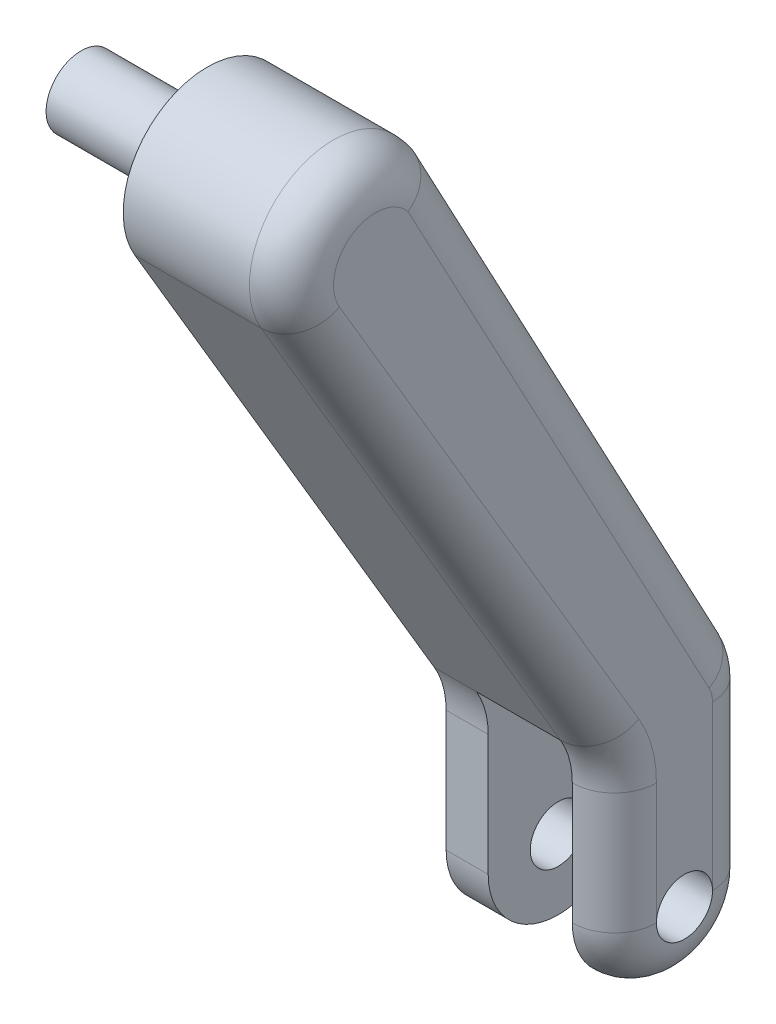
ISO-10303-21;
HEADER;
FILE_DESCRIPTION(('STEP AP214'),'2;1');
FILE_NAME('part.step','',(''),(''),'','','');
FILE_SCHEMA(('AUTOMOTIVE_DESIGN { 1 0 10303 214 1 1 1 1 }'));
ENDSEC;
DATA;
#1=APPLICATION_CONTEXT('core data for automotive mechanical design processes');
#2=APPLICATION_PROTOCOL_DEFINITION('international standard','automotive_design',2000,#1);
#3=PRODUCT_CONTEXT('',#1,'mechanical');
#4=PRODUCT('Part','Part','',(#3));
#5=PRODUCT_RELATED_PRODUCT_CATEGORY('part','',(#4));
#6=PRODUCT_DEFINITION_FORMATION('','',#4);
#7=PRODUCT_DEFINITION_CONTEXT('part definition',#1,'design');
#8=PRODUCT_DEFINITION('design','',#6,#7);
#9=PRODUCT_DEFINITION_SHAPE('','',#8);
#10=(LENGTH_UNIT() NAMED_UNIT(*) SI_UNIT(.MILLI.,.METRE.));
#11=(NAMED_UNIT(*) PLANE_ANGLE_UNIT() SI_UNIT($,.RADIAN.));
#12=(NAMED_UNIT(*) SI_UNIT($,.STERADIAN.) SOLID_ANGLE_UNIT());
#13=UNCERTAINTY_MEASURE_WITH_UNIT(LENGTH_MEASURE(1.E-05),#10,'distance_accuracy_value','');
#14=(GEOMETRIC_REPRESENTATION_CONTEXT(3) GLOBAL_UNCERTAINTY_ASSIGNED_CONTEXT((#13)) GLOBAL_UNIT_ASSIGNED_CONTEXT((#10,
#11,#12)) REPRESENTATION_CONTEXT('',''));
#15=CARTESIAN_POINT('',(0.,0.,0.));
#16=DIRECTION('',(0.,0.,1.));
#17=DIRECTION('',(1.,0.,0.));
#18=AXIS2_PLACEMENT_3D('',#15,#16,#17);
#19=CARTESIAN_POINT('',(0.,13.9972027354736,-26.1932888329424));
#20=DIRECTION('',(0.,-0.471307643009905,0.88196888019955));
#21=DIRECTION('',(0.,-0.88196888019955,-0.471307643009905));
#22=AXIS2_PLACEMENT_3D('',#19,#20,#21);
#23=PLANE('',#22);
#24=DIRECTION('',(1.,0.,0.));
#25=VECTOR('',#24,1.);
#26=CARTESIAN_POINT('',(0.,17.7380335510086,-24.1942589418087));
#27=LINE('',#26,#25);
#28=CARTESIAN_POINT('',(20.,17.7380335510086,-24.1942589418087));
#29=VERTEX_POINT('',#28);
#30=CARTESIAN_POINT('',(45.,17.7380335510086,-24.1942589418087));
#31=VERTEX_POINT('',#30);
#32=EDGE_CURVE('E203',#29,#31,#27,.T.);
#33=ORIENTED_EDGE('',*,*,#32,.T.);
#34=DIRECTION('',(0.,-0.88196888019955,-0.471307643009905));
#35=VECTOR('',#34,1.);
#36=CARTESIAN_POINT('',(45.,-184.18688446411,-132.099151405975));
#37=LINE('',#36,#35);
#38=CARTESIAN_POINT('',(45.,-174.695150912895,-127.026946854847));
#39=VERTEX_POINT('',#38);
#40=EDGE_CURVE('E212',#31,#39,#37,.T.);
#41=ORIENTED_EDGE('',*,*,#40,.T.);
#42=DIRECTION('',(1.,0.,0.));
#43=VECTOR('',#42,1.);
#44=CARTESIAN_POINT('',(15.,-174.695150912895,-127.026946854847));
#45=LINE('',#44,#43);
#46=CARTESIAN_POINT('',(15.,-174.695150912895,-127.026946854847));
#47=VERTEX_POINT('',#46);
#48=EDGE_CURVE('E365',#47,#39,#45,.T.);
#49=ORIENTED_EDGE('',*,*,#48,.F.);
#50=DIRECTION('',(0.,0.881968880199549,0.471307643009906));
#51=VECTOR('',#50,1.);
#52=CARTESIAN_POINT('',(15.,-184.18688446411,-132.099151405975));
#53=LINE('',#52,#51);
#54=CARTESIAN_POINT('',(15.,-184.18688446411,-132.099151405975));
#55=VERTEX_POINT('',#54);
#56=EDGE_CURVE('E420',#55,#47,#53,.T.);
#57=ORIENTED_EDGE('',*,*,#56,.F.);
#58=DIRECTION('',(1.,0.,0.));
#59=VECTOR('',#58,1.);
#60=CARTESIAN_POINT('',(0.,-184.18688446411,-132.099151405975));
#61=LINE('',#60,#59);
#62=CARTESIAN_POINT('',(0.,-184.18688446411,-132.099151405975));
#63=VERTEX_POINT('',#62);
#64=EDGE_CURVE('E404',#63,#55,#61,.T.);
#65=ORIENTED_EDGE('',*,*,#64,.F.);
#66=DIRECTION('',(0.,-0.88196888019955,-0.471307643009905));
#67=VECTOR('',#66,1.);
#68=CARTESIAN_POINT('',(0.,13.9972027354736,-26.1932888329424));
#69=LINE('',#68,#67);
#70=CARTESIAN_POINT('',(0.,10.2563719199386,-28.1923187240761));
#71=VERTEX_POINT('',#70);
#72=EDGE_CURVE('E399',#71,#63,#69,.T.);
#73=ORIENTED_EDGE('',*,*,#72,.F.);
#74=DIRECTION('',(-1.,0.,0.));
#75=VECTOR('',#74,1.);
#76=CARTESIAN_POINT('',(20.,10.2563719199386,-28.1923187240761));
#77=LINE('',#76,#75);
#78=CARTESIAN_POINT('',(20.,10.2563719199386,-28.1923187240761));
#79=VERTEX_POINT('',#78);
#80=EDGE_CURVE('E202',#71,#79,#77,.F.);
#81=ORIENTED_EDGE('',*,*,#80,.T.);
#82=DIRECTION('',(0.,-0.88196888019955,-0.471307643009905));
#83=VECTOR('',#82,1.);
#84=CARTESIAN_POINT('',(20.,13.9972027354736,-26.1932888329424));
#85=LINE('',#84,#83);
#86=EDGE_CURVE('E199',#29,#79,#85,.T.);
#87=ORIENTED_EDGE('',*,*,#86,.F.);
#88=EDGE_LOOP('',(#33,#41,#49,#57,#65,#73,#81,#87));
#89=FACE_BOUND('',#88,.T.);
#90=ADVANCED_FACE('F41',(#89),#23,.F.);
#91=CARTESIAN_POINT('',(0.,-196.184626191974,-110.166203737423));
#92=DIRECTION('',(1.,0.,0.));
#93=DIRECTION('',(0.,0.,-1.));
#94=AXIS2_PLACEMENT_3D('',#91,#92,#93);
#95=CYLINDRICAL_SURFACE('',#94,25.);
#96=ORIENTED_EDGE('',*,*,#64,.T.);
#97=CARTESIAN_POINT('',(15.,-196.184626191974,-110.166203737423));
#98=DIRECTION('',(1.,0.,0.));
#99=DIRECTION('',(0.,0.,-1.));
#100=AXIS2_PLACEMENT_3D('',#97,#98,#99);
#101=CIRCLE('',#100,25.);
#102=CARTESIAN_POINT('',(15.,-196.184626191974,-135.166203737423));
#103=VERTEX_POINT('',#102);
#104=EDGE_CURVE('E419',#103,#55,#101,.T.);
#105=ORIENTED_EDGE('',*,*,#104,.F.);
#106=DIRECTION('',(1.,0.,0.));
#107=VECTOR('',#106,1.);
#108=CARTESIAN_POINT('',(0.,-196.184626191974,-135.166203737423));
#109=LINE('',#108,#107);
#110=CARTESIAN_POINT('',(0.,-196.184626191974,-135.166203737423));
#111=VERTEX_POINT('',#110);
#112=EDGE_CURVE('E407',#111,#103,#109,.T.);
#113=ORIENTED_EDGE('',*,*,#112,.F.);
#114=CARTESIAN_POINT('',(0.,-196.184626191974,-110.166203737423));
#115=DIRECTION('',(1.,0.,0.));
#116=DIRECTION('',(0.,0.,-1.));
#117=AXIS2_PLACEMENT_3D('',#114,#115,#116);
#118=CIRCLE('',#117,25.);
#119=EDGE_CURVE('E396',#111,#63,#118,.T.);
#120=ORIENTED_EDGE('',*,*,#119,.T.);
#121=EDGE_LOOP('',(#96,#105,#113,#120));
#122=FACE_BOUND('',#121,.T.);
#123=ADVANCED_FACE('F291',(#122),#95,.T.);
#124=CARTESIAN_POINT('',(0.,0.,-135.166203737423));
#125=DIRECTION('',(0.,0.,-1.));
#126=DIRECTION('',(0.,1.,0.));
#127=AXIS2_PLACEMENT_3D('',#124,#125,#126);
#128=PLANE('',#127);
#129=ORIENTED_EDGE('',*,*,#112,.T.);
#130=DIRECTION('',(0.,1.,0.));
#131=VECTOR('',#130,1.);
#132=CARTESIAN_POINT('',(15.,-254.457280983061,-135.166203737423));
#133=LINE('',#132,#131);
#134=CARTESIAN_POINT('',(15.,-254.457280983061,-135.166203737423));
#135=VERTEX_POINT('',#134);
#136=EDGE_CURVE('E413',#135,#103,#133,.T.);
#137=ORIENTED_EDGE('',*,*,#136,.F.);
#138=DIRECTION('',(1.,0.,0.));
#139=VECTOR('',#138,1.);
#140=CARTESIAN_POINT('',(0.,-254.457280983061,-135.166203737423));
#141=LINE('',#140,#139);
#142=CARTESIAN_POINT('',(0.,-254.457280983061,-135.166203737423));
#143=VERTEX_POINT('',#142);
#144=EDGE_CURVE('E191',#143,#135,#141,.T.);
#145=ORIENTED_EDGE('',*,*,#144,.F.);
#146=DIRECTION('',(0.,1.,0.));
#147=VECTOR('',#146,1.);
#148=CARTESIAN_POINT('',(0.,0.,-135.166203737423));
#149=LINE('',#148,#147);
#150=EDGE_CURVE('E393',#143,#111,#149,.T.);
#151=ORIENTED_EDGE('',*,*,#150,.T.);
#152=EDGE_LOOP('',(#129,#137,#145,#151));
#153=FACE_BOUND('',#152,.T.);
#154=ADVANCED_FACE('F297',(#153),#128,.T.);
#155=CARTESIAN_POINT('',(0.,-254.457280983061,-110.166203737423));
#156=DIRECTION('',(1.,0.,0.));
#157=DIRECTION('',(0.,0.,-1.));
#158=AXIS2_PLACEMENT_3D('',#155,#156,#157);
#159=CYLINDRICAL_SURFACE('',#158,25.);
#160=ORIENTED_EDGE('',*,*,#144,.T.);
#161=CARTESIAN_POINT('',(15.,-254.457280983061,-110.166203737423));
#162=DIRECTION('',(1.,0.,0.));
#163=DIRECTION('',(0.,0.,-1.));
#164=AXIS2_PLACEMENT_3D('',#161,#162,#163);
#165=CIRCLE('',#164,25.);
#166=CARTESIAN_POINT('',(15.,-254.457280983061,-85.1662037374227));
#167=VERTEX_POINT('',#166);
#168=EDGE_CURVE('E184',#167,#135,#165,.T.);
#169=ORIENTED_EDGE('',*,*,#168,.F.);
#170=DIRECTION('',(1.,0.,0.));
#171=VECTOR('',#170,1.);
#172=CARTESIAN_POINT('',(0.,-254.457280983061,-85.1662037374227));
#173=LINE('',#172,#171);
#174=CARTESIAN_POINT('',(0.,-254.457280983061,-85.1662037374227));
#175=VERTEX_POINT('',#174);
#176=EDGE_CURVE('E183',#175,#167,#173,.T.);
#177=ORIENTED_EDGE('',*,*,#176,.F.);
#178=CARTESIAN_POINT('',(0.,-254.457280983061,-110.166203737423));
#179=DIRECTION('',(1.,0.,0.));
#180=DIRECTION('',(0.,0.,-1.));
#181=AXIS2_PLACEMENT_3D('',#178,#179,#180);
#182=CIRCLE('',#181,25.);
#183=EDGE_CURVE('E390',#175,#143,#182,.T.);
#184=ORIENTED_EDGE('',*,*,#183,.T.);
#185=EDGE_LOOP('',(#160,#169,#177,#184));
#186=FACE_BOUND('',#185,.T.);
#187=ADVANCED_FACE('F307',(#186),#159,.T.);
#188=CARTESIAN_POINT('',(0.,0.,-85.1662037374227));
#189=DIRECTION('',(0.,0.,1.));
#190=DIRECTION('',(1.,0.,0.));
#191=AXIS2_PLACEMENT_3D('',#188,#189,#190);
#192=PLANE('',#191);
#193=ORIENTED_EDGE('',*,*,#176,.T.);
#194=DIRECTION('',(0.,-1.,0.));
#195=VECTOR('',#194,1.);
#196=CARTESIAN_POINT('',(15.,-254.457280983061,-85.1662037374227));
#197=LINE('',#196,#195);
#198=CARTESIAN_POINT('',(15.,-211.225481241882,-85.1662037374227));
#199=VERTEX_POINT('',#198);
#200=EDGE_CURVE('E167',#199,#167,#197,.T.);
#201=ORIENTED_EDGE('',*,*,#200,.F.);
#202=DIRECTION('',(1.,0.,0.));
#203=VECTOR('',#202,1.);
#204=CARTESIAN_POINT('',(0.,-211.225481241882,-85.1662037374227));
#205=LINE('',#204,#203);
#206=CARTESIAN_POINT('',(0.,-211.225481241882,-85.1662037374227));
#207=VERTEX_POINT('',#206);
#208=EDGE_CURVE('E181',#207,#199,#205,.T.);
#209=ORIENTED_EDGE('',*,*,#208,.F.);
#210=DIRECTION('',(0.,-1.,0.));
#211=VECTOR('',#210,1.);
#212=CARTESIAN_POINT('',(0.,0.,-85.1662037374227));
#213=LINE('',#212,#211);
#214=EDGE_CURVE('E388',#207,#175,#213,.T.);
#215=ORIENTED_EDGE('',*,*,#214,.T.);
#216=EDGE_LOOP('',(#193,#201,#209,#215));
#217=FACE_BOUND('',#216,.T.);
#218=ADVANCED_FACE('F179',(#217),#192,.T.);
#219=CARTESIAN_POINT('',(0.,-211.225481241882,-55.1662037374227));
#220=DIRECTION('',(1.,0.,0.));
#221=DIRECTION('',(0.,0.,-1.));
#222=AXIS2_PLACEMENT_3D('',#219,#220,#221);
#223=CYLINDRICAL_SURFACE('',#222,30.);
#224=CARTESIAN_POINT('',(15.,-211.225481241882,-55.1662037374227));
#225=DIRECTION('',(-1.,0.,0.));
#226=DIRECTION('',(0.,0.,-1.));
#227=AXIS2_PLACEMENT_3D('',#224,#225,#226);
#228=CIRCLE('',#227,30.);
#229=CARTESIAN_POINT('',(15.,-195.95899361436,-80.9912759642089));
#230=VERTEX_POINT('',#229);
#231=EDGE_CURVE('E163',#230,#199,#228,.T.);
#232=ORIENTED_EDGE('',*,*,#231,.F.);
#233=DIRECTION('',(1.,0.,0.));
#234=VECTOR('',#233,1.);
#235=CARTESIAN_POINT('',(0.,-195.95899361436,-80.9912759642089));
#236=LINE('',#235,#234);
#237=CARTESIAN_POINT('',(0.,-195.95899361436,-80.9912759642089));
#238=VERTEX_POINT('',#237);
#239=EDGE_CURVE('E189',#238,#230,#236,.T.);
#240=ORIENTED_EDGE('',*,*,#239,.F.);
#241=CARTESIAN_POINT('',(0.,-211.225481241882,-55.1662037374227));
#242=DIRECTION('',(1.,0.,0.));
#243=DIRECTION('',(0.,0.,-1.));
#244=AXIS2_PLACEMENT_3D('',#241,#242,#243);
#245=CIRCLE('',#244,30.);
#246=EDGE_CURVE('E187',#207,#238,#245,.T.);
#247=ORIENTED_EDGE('',*,*,#246,.F.);
#248=ORIENTED_EDGE('',*,*,#208,.T.);
#249=EDGE_LOOP('',(#232,#240,#247,#248));
#250=FACE_BOUND('',#249,.T.);
#251=ADVANCED_FACE('F186',(#250),#223,.F.);
#252=CARTESIAN_POINT('',(0.,-254.457280983061,-110.166203737423));
#253=DIRECTION('',(1.,0.,0.));
#254=DIRECTION('',(0.,0.,-1.));
#255=AXIS2_PLACEMENT_3D('',#252,#253,#254);
#256=CYLINDRICAL_SURFACE('',#255,10.);
#257=CARTESIAN_POINT('',(0.,-254.457280983061,-110.166203737423));
#258=DIRECTION('',(1.,0.,0.));
#259=DIRECTION('',(0.,0.,-1.));
#260=AXIS2_PLACEMENT_3D('',#257,#258,#259);
#261=CIRCLE('',#260,10.);
#262=CARTESIAN_POINT('',(0.,-254.457280983061,-120.166203737423));
#263=VERTEX_POINT('',#262);
#264=EDGE_CURVE('E198',#263,#263,#261,.T.);
#265=ORIENTED_EDGE('',*,*,#264,.F.);
#266=EDGE_LOOP('',(#265));
#267=FACE_BOUND('',#266,.T.);
#268=CARTESIAN_POINT('',(15.,-254.457280983061,-110.166203737423));
#269=DIRECTION('',(1.,0.,0.));
#270=DIRECTION('',(0.,0.,-1.));
#271=AXIS2_PLACEMENT_3D('',#268,#269,#270);
#272=CIRCLE('',#271,10.);
#273=CARTESIAN_POINT('',(15.,-254.457280983061,-120.166203737423));
#274=VERTEX_POINT('',#273);
#275=EDGE_CURVE('E220',#274,#274,#272,.F.);
#276=ORIENTED_EDGE('',*,*,#275,.F.);
#277=EDGE_LOOP('',(#276));
#278=FACE_BOUND('',#277,.T.);
#279=ADVANCED_FACE('F316',(#267,#278),#256,.F.);
#280=CARTESIAN_POINT('',(20.,0.,0.));
#281=DIRECTION('',(-1.,0.,0.));
#282=DIRECTION('',(0.,0.,1.));
#283=AXIS2_PLACEMENT_3D('',#280,#281,#282);
#284=CYLINDRICAL_SURFACE('',#283,30.);
#285=DIRECTION('',(1.,0.,0.));
#286=VECTOR('',#285,1.);
#287=CARTESIAN_POINT('',(0.,-15.2664876275219,25.8250722267861));
#288=LINE('',#287,#286);
#289=CARTESIAN_POINT('',(0.,-15.2664876275219,25.8250722267861));
#290=VERTEX_POINT('',#289);
#291=CARTESIAN_POINT('',(45.,-15.2664876275219,25.8250722267861));
#292=VERTEX_POINT('',#291);
#293=EDGE_CURVE('E193',#290,#292,#288,.T.);
#294=ORIENTED_EDGE('',*,*,#293,.T.);
#295=CARTESIAN_POINT('',(45.,0.,0.));
#296=DIRECTION('',(1.,0.,0.));
#297=DIRECTION('',(0.,0.,-1.));
#298=AXIS2_PLACEMENT_3D('',#295,#296,#297);
#299=CIRCLE('',#298,30.);
#300=EDGE_CURVE('E11',#292,#31,#299,.F.);
#301=ORIENTED_EDGE('',*,*,#300,.T.);
#302=ORIENTED_EDGE('',*,*,#32,.F.);
#303=CARTESIAN_POINT('',(20.,0.,0.));
#304=DIRECTION('',(1.,0.,0.));
#305=DIRECTION('',(0.,0.,-1.));
#306=AXIS2_PLACEMENT_3D('',#303,#304,#305);
#307=CIRCLE('',#306,30.);
#308=EDGE_CURVE('E213',#79,#29,#307,.T.);
#309=ORIENTED_EDGE('',*,*,#308,.F.);
#310=ORIENTED_EDGE('',*,*,#80,.F.);
#311=CARTESIAN_POINT('',(0.,0.,0.));
#312=DIRECTION('',(1.,0.,0.));
#313=DIRECTION('',(0.,0.,-1.));
#314=AXIS2_PLACEMENT_3D('',#311,#312,#313);
#315=CIRCLE('',#314,30.);
#316=EDGE_CURVE('E208',#71,#290,#315,.T.);
#317=ORIENTED_EDGE('',*,*,#316,.T.);
#318=EDGE_LOOP('',(#294,#301,#302,#309,#310,#317));
#319=FACE_BOUND('',#318,.T.);
#320=ADVANCED_FACE('F332',(#319),#284,.T.);
#321=CARTESIAN_POINT('',(20.,0.,0.));
#322=DIRECTION('',(1.,0.,0.));
#323=DIRECTION('',(0.,0.,-1.));
#324=AXIS2_PLACEMENT_3D('',#321,#322,#323);
#325=PLANE('',#324);
#326=ORIENTED_EDGE('',*,*,#308,.T.);
#327=ORIENTED_EDGE('',*,*,#86,.T.);
#328=EDGE_LOOP('',(#326,#327));
#329=FACE_BOUND('',#328,.T.);
#330=ADVANCED_FACE('F329',(#329),#325,.T.);
#331=CARTESIAN_POINT('',(0.,0.,0.));
#332=DIRECTION('',(1.,0.,0.));
#333=DIRECTION('',(0.,0.,-1.));
#334=AXIS2_PLACEMENT_3D('',#331,#332,#333);
#335=PLANE('',#334);
#336=CARTESIAN_POINT('',(0.,0.,0.));
#337=DIRECTION('',(-1.,0.,0.));
#338=DIRECTION('',(0.,0.,1.));
#339=AXIS2_PLACEMENT_3D('',#336,#337,#338);
#340=CIRCLE('',#339,12.5);
#341=CARTESIAN_POINT('',(0.,0.,-12.5));
#342=VERTEX_POINT('',#341);
#343=EDGE_CURVE('E209',#342,#342,#340,.T.);
#344=ORIENTED_EDGE('',*,*,#343,.F.);
#345=EDGE_LOOP('',(#344));
#346=FACE_BOUND('',#345,.T.);
#347=DIRECTION('',(0.,-0.860835740892872,-0.508882920917396));
#348=VECTOR('',#347,1.);
#349=CARTESIAN_POINT('',(0.,-15.2664876275219,25.8250722267861));
#350=LINE('',#349,#348);
#351=EDGE_CURVE('E385',#290,#238,#350,.T.);
#352=ORIENTED_EDGE('',*,*,#351,.F.);
#353=ORIENTED_EDGE('',*,*,#316,.F.);
#354=ORIENTED_EDGE('',*,*,#72,.T.);
#355=ORIENTED_EDGE('',*,*,#119,.F.);
#356=ORIENTED_EDGE('',*,*,#150,.F.);
#357=ORIENTED_EDGE('',*,*,#183,.F.);
#358=ORIENTED_EDGE('',*,*,#214,.F.);
#359=ORIENTED_EDGE('',*,*,#246,.T.);
#360=EDGE_LOOP('',(#352,#353,#354,#355,#356,#357,#358,#359));
#361=FACE_BOUND('',#360,.T.);
#362=ORIENTED_EDGE('',*,*,#264,.T.);
#363=EDGE_LOOP('',(#362));
#364=FACE_BOUND('',#363,.T.);
#365=ADVANCED_FACE('F327',(#346,#361,#364),#335,.F.);
#366=CARTESIAN_POINT('',(-45.,0.,0.));
#367=DIRECTION('',(1.,0.,0.));
#368=DIRECTION('',(0.,0.,-1.));
#369=AXIS2_PLACEMENT_3D('',#366,#367,#368);
#370=CYLINDRICAL_SURFACE('',#369,12.5);
#371=CARTESIAN_POINT('',(-45.,0.,0.));
#372=DIRECTION('',(-1.,0.,0.));
#373=DIRECTION('',(0.,0.,1.));
#374=AXIS2_PLACEMENT_3D('',#371,#372,#373);
#375=CIRCLE('',#374,12.5);
#376=CARTESIAN_POINT('',(-45.,0.,-12.5));
#377=VERTEX_POINT('',#376);
#378=EDGE_CURVE('E205',#377,#377,#375,.T.);
#379=CARTESIAN_POINT('',(-45.,0.,-12.5));
#380=CARTESIAN_POINT('',(-44.53125,0.,-12.5));
#381=CARTESIAN_POINT('',(-44.0625,0.,-12.5));
#382=CARTESIAN_POINT('',(-43.125,0.,-12.5));
#383=CARTESIAN_POINT('',(-42.65625,0.,-12.5));
#384=CARTESIAN_POINT('',(-41.71875,0.,-12.5));
#385=CARTESIAN_POINT('',(-41.25,0.,-12.5));
#386=CARTESIAN_POINT('',(-40.3125,0.,-12.5));
#387=CARTESIAN_POINT('',(-39.84375,0.,-12.5));
#388=CARTESIAN_POINT('',(-38.90625,0.,-12.5));
#389=CARTESIAN_POINT('',(-38.4375,0.,-12.5));
#390=CARTESIAN_POINT('',(-37.5,0.,-12.5));
#391=CARTESIAN_POINT('',(-37.03125,0.,-12.5));
#392=CARTESIAN_POINT('',(-36.09375,0.,-12.5));
#393=CARTESIAN_POINT('',(-35.625,0.,-12.5));
#394=CARTESIAN_POINT('',(-34.6875,0.,-12.5));
#395=CARTESIAN_POINT('',(-34.21875,0.,-12.5));
#396=CARTESIAN_POINT('',(-33.28125,0.,-12.5));
#397=CARTESIAN_POINT('',(-32.8125,0.,-12.5));
#398=CARTESIAN_POINT('',(-31.875,0.,-12.5));
#399=CARTESIAN_POINT('',(-31.40625,0.,-12.5));
#400=CARTESIAN_POINT('',(-30.46875,0.,-12.5));
#401=CARTESIAN_POINT('',(-30.,0.,-12.5));
#402=CARTESIAN_POINT('',(-29.0625,0.,-12.5));
#403=CARTESIAN_POINT('',(-28.59375,0.,-12.5));
#404=CARTESIAN_POINT('',(-27.65625,0.,-12.5));
#405=CARTESIAN_POINT('',(-27.1875,0.,-12.5));
#406=CARTESIAN_POINT('',(-26.25,0.,-12.5));
#407=CARTESIAN_POINT('',(-25.78125,0.,-12.5));
#408=CARTESIAN_POINT('',(-24.84375,0.,-12.5));
#409=CARTESIAN_POINT('',(-24.375,0.,-12.5));
#410=CARTESIAN_POINT('',(-23.4375,0.,-12.5));
#411=CARTESIAN_POINT('',(-22.96875,0.,-12.5));
#412=CARTESIAN_POINT('',(-22.03125,0.,-12.5));
#413=CARTESIAN_POINT('',(-21.5625,0.,-12.5));
#414=CARTESIAN_POINT('',(-20.625,0.,-12.5));
#415=CARTESIAN_POINT('',(-20.15625,0.,-12.5));
#416=CARTESIAN_POINT('',(-19.21875,0.,-12.5));
#417=CARTESIAN_POINT('',(-18.75,0.,-12.5));
#418=CARTESIAN_POINT('',(-17.8125,0.,-12.5));
#419=CARTESIAN_POINT('',(-17.34375,0.,-12.5));
#420=CARTESIAN_POINT('',(-16.40625,0.,-12.5));
#421=CARTESIAN_POINT('',(-15.9375,0.,-12.5));
#422=CARTESIAN_POINT('',(-15.,0.,-12.5));
#423=CARTESIAN_POINT('',(-14.53125,0.,-12.5));
#424=CARTESIAN_POINT('',(-13.59375,0.,-12.5));
#425=CARTESIAN_POINT('',(-13.125,0.,-12.5));
#426=CARTESIAN_POINT('',(-12.1875,0.,-12.5));
#427=CARTESIAN_POINT('',(-11.71875,0.,-12.5));
#428=CARTESIAN_POINT('',(-10.78125,0.,-12.5));
#429=CARTESIAN_POINT('',(-10.3125,0.,-12.5));
#430=CARTESIAN_POINT('',(-9.37499999999999,0.,-12.5));
#431=CARTESIAN_POINT('',(-8.90624999999999,0.,-12.5));
#432=CARTESIAN_POINT('',(-7.96874999999999,0.,-12.5));
#433=CARTESIAN_POINT('',(-7.5,0.,-12.5));
#434=CARTESIAN_POINT('',(-6.56249999999999,0.,-12.5));
#435=CARTESIAN_POINT('',(-6.09374999999999,0.,-12.5));
#436=CARTESIAN_POINT('',(-5.15624999999999,0.,-12.5));
#437=CARTESIAN_POINT('',(-4.68749999999999,0.,-12.5));
#438=CARTESIAN_POINT('',(-3.74999999999999,0.,-12.5));
#439=CARTESIAN_POINT('',(-3.28124999999999,0.,-12.5));
#440=CARTESIAN_POINT('',(-2.34374999999999,0.,-12.5));
#441=CARTESIAN_POINT('',(-1.87499999999999,0.,-12.5));
#442=CARTESIAN_POINT('',(-0.937499999999992,0.,-12.5));
#443=CARTESIAN_POINT('',(-0.468749999999993,0.,-12.5));
#444=CARTESIAN_POINT('',(0.,0.,-12.5));
#445=B_SPLINE_CURVE_WITH_KNOTS('',3,(#379,#380,#381,#382,#383,#384,#385,#386,#387,#388,#389,
#390,#391,#392,#393,#394,#395,#396,#397,#398,#399,#400,#401,#402,#403,#404,#405,#406,#407,#408,
#409,#410,#411,#412,#413,#414,#415,#416,#417,#418,#419,#420,#421,#422,#423,#424,#425,#426,#427,
#428,#429,#430,#431,#432,#433,#434,#435,#436,#437,#438,#439,#440,#441,#442,#443,#444),
.UNSPECIFIED.,.F.,.F.,(4,2,2,2,2,2,2,2,2,2,2,2,2,2,2,2,2,2,2,2,2,2,2,2,2,2,2,2,2,2,2,2,4),(0.,
1.40625,2.8125,4.21874999999999,5.625,7.03125,8.43749999999999,9.84375,11.25,12.65625,14.0625,
15.46875,16.875,18.28125,19.6875,21.09375,22.5,23.90625,25.3125,26.71875,28.125,29.53125,
30.9375,32.34375,33.75,35.15625,36.5625,37.96875,39.375,40.78125,42.1875,43.59375,45.),.UNSPECIFIED.);
#446=EDGE_CURVE('BSEAM323',#377,#342,#445,.T.);
#447=ORIENTED_EDGE('',*,*,#378,.F.);
#448=ORIENTED_EDGE('',*,*,#343,.T.);
#449=ORIENTED_EDGE('',*,*,#446,.T.);
#450=ORIENTED_EDGE('',*,*,#446,.F.);
#451=EDGE_LOOP('',(#447,#449,#448,#450));
#452=FACE_BOUND('',#451,.T.);
#453=ADVANCED_FACE('F323',(#452),#370,.T.);
#454=CARTESIAN_POINT('',(-45.,0.,0.));
#455=DIRECTION('',(-1.,0.,0.));
#456=DIRECTION('',(0.,0.,1.));
#457=AXIS2_PLACEMENT_3D('',#454,#455,#456);
#458=PLANE('',#457);
#459=ORIENTED_EDGE('',*,*,#378,.T.);
#460=EDGE_LOOP('',(#459));
#461=FACE_BOUND('',#460,.T.);
#462=ADVANCED_FACE('F320',(#461),#458,.T.);
#463=CARTESIAN_POINT('',(0.,-15.2664876275219,25.8250722267861));
#464=DIRECTION('',(0.,-0.508882920917396,0.860835740892872));
#465=DIRECTION('',(0.,-0.860835740892872,-0.508882920917396));
#466=AXIS2_PLACEMENT_3D('',#463,#464,#465);
#467=PLANE('',#466);
#468=DIRECTION('',(1.,0.,0.));
#469=VECTOR('',#468,1.);
#470=CARTESIAN_POINT('',(15.,-195.95899361436,-80.9912759642089));
#471=LINE('',#470,#469);
#472=CARTESIAN_POINT('',(45.,-195.95899361436,-80.9912759642089));
#473=VERTEX_POINT('',#472);
#474=EDGE_CURVE('E221',#230,#473,#471,.T.);
#475=ORIENTED_EDGE('',*,*,#474,.T.);
#476=DIRECTION('',(0.,-0.860835740892872,-0.508882920917396));
#477=VECTOR('',#476,1.);
#478=CARTESIAN_POINT('',(45.,-15.2664876275219,25.8250722267861));
#479=LINE('',#478,#477);
#480=EDGE_CURVE('E50',#473,#292,#479,.F.);
#481=ORIENTED_EDGE('',*,*,#480,.T.);
#482=ORIENTED_EDGE('',*,*,#293,.F.);
#483=ORIENTED_EDGE('',*,*,#351,.T.);
#484=ORIENTED_EDGE('',*,*,#239,.T.);
#485=EDGE_LOOP('',(#475,#481,#482,#483,#484));
#486=FACE_BOUND('',#485,.T.);
#487=ADVANCED_FACE('F317',(#486),#467,.T.);
#488=CARTESIAN_POINT('',(45.,-254.457280983061,-110.166203737423));
#489=DIRECTION('',(1.,0.,0.));
#490=DIRECTION('',(0.,0.,-1.));
#491=AXIS2_PLACEMENT_3D('',#488,#489,#490);
#492=CIRCLE('',#491,10.);
#493=CARTESIAN_POINT('',(45.,-254.457280983061,-120.166203737423));
#494=VERTEX_POINT('',#493);
#495=EDGE_CURVE('E217',#494,#494,#492,.F.);
#496=ORIENTED_EDGE('',*,*,#495,.T.);
#497=EDGE_LOOP('',(#496));
#498=FACE_BOUND('',#497,.T.);
#499=CARTESIAN_POINT('',(60.,-254.457280983061,-110.166203737423));
#500=DIRECTION('',(1.,0.,0.));
#501=DIRECTION('',(0.,0.,-1.));
#502=AXIS2_PLACEMENT_3D('',#499,#500,#501);
#503=CIRCLE('',#502,10.);
#504=CARTESIAN_POINT('',(60.,-254.457280983061,-120.166203737423));
#505=VERTEX_POINT('',#504);
#506=CARTESIAN_POINT('',(60.,-254.457280983061,-100.166203737423));
#507=VERTEX_POINT('',#506);
#508=EDGE_CURVE('E382',#505,#507,#503,.T.);
#509=ORIENTED_EDGE('',*,*,#508,.T.);
#510=EDGE_CURVE('E224',#507,#505,#503,.T.);
#511=ORIENTED_EDGE('',*,*,#510,.T.);
#512=EDGE_LOOP('',(#509,#511));
#513=FACE_BOUND('',#512,.T.);
#514=ADVANCED_FACE('F302',(#498,#513),#256,.F.);
#515=CARTESIAN_POINT('',(60.,0.,0.));
#516=DIRECTION('',(1.,0.,0.));
#517=DIRECTION('',(0.,0.,-1.));
#518=AXIS2_PLACEMENT_3D('',#515,#516,#517);
#519=PLANE('',#518);
#520=ORIENTED_EDGE('',*,*,#508,.F.);
#521=DIRECTION('',(0.,1.,0.));
#522=VECTOR('',#521,1.);
#523=CARTESIAN_POINT('',(60.,0.,-120.166203737423));
#524=LINE('',#523,#522);
#525=CARTESIAN_POINT('',(60.,-196.184626191974,-120.166203737423));
#526=VERTEX_POINT('',#525);
#527=EDGE_CURVE('E65',#505,#526,#524,.T.);
#528=ORIENTED_EDGE('',*,*,#527,.T.);
#529=CARTESIAN_POINT('',(60.,-196.184626191974,-110.166203737423));
#530=DIRECTION('',(1.,0.,0.));
#531=DIRECTION('',(0.,0.,-1.));
#532=AXIS2_PLACEMENT_3D('',#529,#530,#531);
#533=CIRCLE('',#532,9.99999999999999);
#534=CARTESIAN_POINT('',(60.,-191.335749294939,-118.911968017198));
#535=VERTEX_POINT('',#534);
#536=EDGE_CURVE('E238',#526,#535,#533,.T.);
#537=ORIENTED_EDGE('',*,*,#536,.T.);
#538=DIRECTION('',(0.,-0.88196888019955,-0.471307643009905));
#539=VECTOR('',#538,1.);
#540=CARTESIAN_POINT('',(60.,10.6684189058601,-10.9647257388155));
#541=LINE('',#540,#539);
#542=CARTESIAN_POINT('',(60.,9.56607036922571,-11.5538001406906));
#543=VERTEX_POINT('',#542);
#544=EDGE_CURVE('E235',#535,#543,#541,.F.);
#545=ORIENTED_EDGE('',*,*,#544,.T.);
#546=CARTESIAN_POINT('',(60.,0.,0.));
#547=DIRECTION('',(1.,0.,0.));
#548=DIRECTION('',(0.,0.,-1.));
#549=AXIS2_PLACEMENT_3D('',#546,#547,#548);
#550=CIRCLE('',#549,15.);
#551=CARTESIAN_POINT('',(60.,-7.63324381376094,12.9125361133931));
#552=VERTEX_POINT('',#551);
#553=EDGE_CURVE('E227',#543,#552,#550,.T.);
#554=ORIENTED_EDGE('',*,*,#553,.T.);
#555=DIRECTION('',(0.,-0.860835740892872,-0.508882920917396));
#556=VECTOR('',#555,1.);
#557=CARTESIAN_POINT('',(60.,-7.63324381376094,12.9125361133931));
#558=LINE('',#557,#556);
#559=CARTESIAN_POINT('',(60.,-188.325749800599,-93.903812077602));
#560=VERTEX_POINT('',#559);
#561=EDGE_CURVE('E229',#552,#560,#558,.T.);
#562=ORIENTED_EDGE('',*,*,#561,.T.);
#563=CARTESIAN_POINT('',(60.,-211.225481241882,-55.1662037374227));
#564=DIRECTION('',(1.,0.,0.));
#565=DIRECTION('',(0.,0.,-1.));
#566=AXIS2_PLACEMENT_3D('',#563,#564,#565);
#567=CIRCLE('',#566,45.);
#568=CARTESIAN_POINT('',(60.,-211.225481241882,-100.166203737423));
#569=VERTEX_POINT('',#568);
#570=EDGE_CURVE('E231',#560,#569,#567,.F.);
#571=ORIENTED_EDGE('',*,*,#570,.T.);
#572=DIRECTION('',(0.,-1.,0.));
#573=VECTOR('',#572,1.);
#574=CARTESIAN_POINT('',(60.,0.,-100.166203737423));
#575=LINE('',#574,#573);
#576=EDGE_CURVE('E233',#569,#507,#575,.T.);
#577=ORIENTED_EDGE('',*,*,#576,.T.);
#578=EDGE_LOOP('',(#520,#528,#537,#545,#554,#562,#571,#577));
#579=FACE_BOUND('',#578,.T.);
#580=ADVANCED_FACE('F439',(#579),#519,.T.);
#581=CARTESIAN_POINT('',(15.,-211.225481241882,-55.1662037374227));
#582=DIRECTION('',(1.,0.,0.));
#583=DIRECTION('',(0.,0.,-1.));
#584=AXIS2_PLACEMENT_3D('',#581,#582,#583);
#585=PLANE('',#584);
#586=ORIENTED_EDGE('',*,*,#231,.T.);
#587=ORIENTED_EDGE('',*,*,#200,.T.);
#588=ORIENTED_EDGE('',*,*,#168,.T.);
#589=ORIENTED_EDGE('',*,*,#136,.T.);
#590=ORIENTED_EDGE('',*,*,#104,.T.);
#591=ORIENTED_EDGE('',*,*,#56,.T.);
#592=DIRECTION('',(0.,-0.419328190369282,0.907834714450611));
#593=VECTOR('',#592,1.);
#594=CARTESIAN_POINT('',(15.,-195.95899361436,-80.9912759642089));
#595=LINE('',#594,#593);
#596=EDGE_CURVE('E170',#47,#230,#595,.T.);
#597=ORIENTED_EDGE('',*,*,#596,.T.);
#598=EDGE_LOOP('',(#586,#587,#588,#589,#590,#591,#597));
#599=FACE_BOUND('',#598,.T.);
#600=ORIENTED_EDGE('',*,*,#275,.T.);
#601=EDGE_LOOP('',(#600));
#602=FACE_BOUND('',#601,.T.);
#603=ADVANCED_FACE('F165',(#599,#602),#585,.T.);
#604=CARTESIAN_POINT('',(45.,-211.225481241882,-55.1662037374227));
#605=DIRECTION('',(1.,0.,0.));
#606=DIRECTION('',(0.,0.,-1.));
#607=AXIS2_PLACEMENT_3D('',#604,#605,#606);
#608=PLANE('',#607);
#609=CARTESIAN_POINT('',(45.,-211.225481241882,-55.1662037374227));
#610=DIRECTION('',(-1.,0.,0.));
#611=DIRECTION('',(0.,0.,-1.));
#612=AXIS2_PLACEMENT_3D('',#609,#610,#611);
#613=CIRCLE('',#612,30.);
#614=CARTESIAN_POINT('',(45.,-211.225481241882,-85.1662037374227));
#615=VERTEX_POINT('',#614);
#616=EDGE_CURVE('E375',#473,#615,#613,.T.);
#617=ORIENTED_EDGE('',*,*,#616,.F.);
#618=DIRECTION('',(0.,-0.419328190369282,0.907834714450611));
#619=VECTOR('',#618,1.);
#620=CARTESIAN_POINT('',(45.,-195.95899361436,-80.9912759642089));
#621=LINE('',#620,#619);
#622=EDGE_CURVE('E175',#39,#473,#621,.T.);
#623=ORIENTED_EDGE('',*,*,#622,.F.);
#624=DIRECTION('',(0.,0.881968880199549,0.471307643009906));
#625=VECTOR('',#624,1.);
#626=CARTESIAN_POINT('',(45.,-184.18688446411,-132.099151405975));
#627=LINE('',#626,#625);
#628=CARTESIAN_POINT('',(45.,-184.18688446411,-132.099151405975));
#629=VERTEX_POINT('',#628);
#630=EDGE_CURVE('E361',#629,#39,#627,.T.);
#631=ORIENTED_EDGE('',*,*,#630,.F.);
#632=CARTESIAN_POINT('',(45.,-196.184626191974,-110.166203737423));
#633=DIRECTION('',(1.,0.,0.));
#634=DIRECTION('',(0.,0.,-1.));
#635=AXIS2_PLACEMENT_3D('',#632,#633,#634);
#636=CIRCLE('',#635,25.);
#637=CARTESIAN_POINT('',(45.,-196.184626191974,-135.166203737423));
#638=VERTEX_POINT('',#637);
#639=EDGE_CURVE('E377',#638,#629,#636,.T.);
#640=ORIENTED_EDGE('',*,*,#639,.F.);
#641=DIRECTION('',(0.,1.,0.));
#642=VECTOR('',#641,1.);
#643=CARTESIAN_POINT('',(45.,-254.457280983061,-135.166203737423));
#644=LINE('',#643,#642);
#645=CARTESIAN_POINT('',(45.,-254.457280983061,-135.166203737423));
#646=VERTEX_POINT('',#645);
#647=EDGE_CURVE('E434',#646,#638,#644,.T.);
#648=ORIENTED_EDGE('',*,*,#647,.F.);
#649=CARTESIAN_POINT('',(45.,-254.457280983061,-110.166203737423));
#650=DIRECTION('',(1.,0.,0.));
#651=DIRECTION('',(0.,0.,-1.));
#652=AXIS2_PLACEMENT_3D('',#649,#650,#651);
#653=CIRCLE('',#652,25.);
#654=CARTESIAN_POINT('',(45.,-254.457280983061,-85.1662037374227));
#655=VERTEX_POINT('',#654);
#656=EDGE_CURVE('E431',#655,#646,#653,.T.);
#657=ORIENTED_EDGE('',*,*,#656,.F.);
#658=DIRECTION('',(0.,-1.,0.));
#659=VECTOR('',#658,1.);
#660=CARTESIAN_POINT('',(45.,-254.457280983061,-85.1662037374227));
#661=LINE('',#660,#659);
#662=EDGE_CURVE('E428',#615,#655,#661,.T.);
#663=ORIENTED_EDGE('',*,*,#662,.F.);
#664=EDGE_LOOP('',(#617,#623,#631,#640,#648,#657,#663));
#665=FACE_BOUND('',#664,.T.);
#666=ORIENTED_EDGE('',*,*,#495,.F.);
#667=EDGE_LOOP('',(#666));
#668=FACE_BOUND('',#667,.T.);
#669=ADVANCED_FACE('F371',(#665,#668),#608,.F.);
#670=CARTESIAN_POINT('',(15.,-195.95899361436,-80.9912759642089));
#671=DIRECTION('',(0.,0.907834714450611,0.419328190369282));
#672=DIRECTION('',(0.,-0.419328190369282,0.907834714450611));
#673=AXIS2_PLACEMENT_3D('',#670,#671,#672);
#674=PLANE('',#673);
#675=ORIENTED_EDGE('',*,*,#622,.T.);
#676=ORIENTED_EDGE('',*,*,#474,.F.);
#677=ORIENTED_EDGE('',*,*,#596,.F.);
#678=ORIENTED_EDGE('',*,*,#48,.T.);
#679=EDGE_LOOP('',(#675,#676,#677,#678));
#680=FACE_BOUND('',#679,.T.);
#681=ADVANCED_FACE('F287',(#680),#674,.F.);
#682=CARTESIAN_POINT('',(45.,0.,-100.166203737423));
#683=DIRECTION('',(0.,-1.,0.));
#684=DIRECTION('',(0.,0.,-1.));
#685=AXIS2_PLACEMENT_3D('',#682,#683,#684);
#686=CYLINDRICAL_SURFACE('',#685,15.);
#687=CARTESIAN_POINT('',(45.,-254.457280983061,-100.166203737423));
#688=DIRECTION('',(0.,-1.,0.));
#689=DIRECTION('',(0.,0.,-1.));
#690=AXIS2_PLACEMENT_3D('',#687,#688,#689);
#691=CIRCLE('',#690,15.);
#692=EDGE_CURVE('E445',#507,#655,#691,.T.);
#693=ORIENTED_EDGE('',*,*,#692,.F.);
#694=ORIENTED_EDGE('',*,*,#576,.F.);
#695=CARTESIAN_POINT('',(45.,-211.225481241882,-100.166203737423));
#696=DIRECTION('',(0.,1.,0.));
#697=DIRECTION('',(0.,0.,1.));
#698=AXIS2_PLACEMENT_3D('',#695,#696,#697);
#699=CIRCLE('',#698,15.);
#700=EDGE_CURVE('E45',#615,#569,#699,.T.);
#701=ORIENTED_EDGE('',*,*,#700,.F.);
#702=ORIENTED_EDGE('',*,*,#662,.T.);
#703=EDGE_LOOP('',(#693,#694,#701,#702));
#704=FACE_BOUND('',#703,.T.);
#705=ADVANCED_FACE('F43',(#704),#686,.T.);
#706=CARTESIAN_POINT('',(45.,-211.225481241882,-55.1662037374227));
#707=DIRECTION('',(1.,0.,0.));
#708=DIRECTION('',(0.,0.,-1.));
#709=AXIS2_PLACEMENT_3D('',#706,#707,#708);
#710=TOROIDAL_SURFACE('',#709,45.,15.);
#711=ORIENTED_EDGE('',*,*,#700,.T.);
#712=ORIENTED_EDGE('',*,*,#570,.F.);
#713=CARTESIAN_POINT('',(45.,-188.325749800599,-93.9038120776019));
#714=DIRECTION('',(0.,0.860835740892871,0.508882920917397));
#715=DIRECTION('',(0.,-0.508882920917397,0.860835740892871));
#716=AXIS2_PLACEMENT_3D('',#713,#714,#715);
#717=CIRCLE('',#716,15.);
#718=EDGE_CURVE('E443',#473,#560,#717,.T.);
#719=ORIENTED_EDGE('',*,*,#718,.F.);
#720=ORIENTED_EDGE('',*,*,#616,.T.);
#721=EDGE_LOOP('',(#711,#712,#719,#720));
#722=FACE_BOUND('',#721,.T.);
#723=ADVANCED_FACE('F280',(#722),#710,.T.);
#724=CARTESIAN_POINT('',(45.,-254.457280983061,-110.166203737423));
#725=DIRECTION('',(1.,0.,0.));
#726=DIRECTION('',(0.,0.,-1.));
#727=AXIS2_PLACEMENT_3D('',#724,#725,#726);
#728=DEGENERATE_TOROIDAL_SURFACE('',#727,10.,15.,.T.);
#729=ORIENTED_EDGE('',*,*,#692,.T.);
#730=ORIENTED_EDGE('',*,*,#656,.T.);
#731=CARTESIAN_POINT('',(45.,-254.457280983061,-120.166203737423));
#732=DIRECTION('',(0.,1.,0.));
#733=DIRECTION('',(0.,0.,1.));
#734=AXIS2_PLACEMENT_3D('',#731,#732,#733);
#735=CIRCLE('',#734,15.);
#736=EDGE_CURVE('E354',#505,#646,#735,.T.);
#737=ORIENTED_EDGE('',*,*,#736,.F.);
#738=ORIENTED_EDGE('',*,*,#510,.F.);
#739=EDGE_LOOP('',(#729,#730,#737,#738));
#740=FACE_BOUND('',#739,.T.);
#741=ADVANCED_FACE('F277',(#740),#728,.T.);
#742=CARTESIAN_POINT('',(45.,-7.63324381376094,12.9125361133931));
#743=DIRECTION('',(0.,-0.860835740892872,-0.508882920917396));
#744=DIRECTION('',(0.,0.508882920917396,-0.860835740892872));
#745=AXIS2_PLACEMENT_3D('',#742,#743,#744);
#746=CYLINDRICAL_SURFACE('',#745,15.);
#747=ORIENTED_EDGE('',*,*,#718,.T.);
#748=ORIENTED_EDGE('',*,*,#561,.F.);
#749=CARTESIAN_POINT('',(45.,-7.63324381376094,12.9125361133931));
#750=DIRECTION('',(0.,0.860835740892872,0.508882920917396));
#751=DIRECTION('',(0.,-0.508882920917396,0.860835740892872));
#752=AXIS2_PLACEMENT_3D('',#749,#750,#751);
#753=CIRCLE('',#752,15.);
#754=EDGE_CURVE('E351',#292,#552,#753,.T.);
#755=ORIENTED_EDGE('',*,*,#754,.F.);
#756=ORIENTED_EDGE('',*,*,#480,.F.);
#757=EDGE_LOOP('',(#747,#748,#755,#756));
#758=FACE_BOUND('',#757,.T.);
#759=ADVANCED_FACE('F273',(#758),#746,.T.);
#760=CARTESIAN_POINT('',(45.,0.,-120.166203737423));
#761=DIRECTION('',(0.,1.,0.));
#762=DIRECTION('',(0.,0.,1.));
#763=AXIS2_PLACEMENT_3D('',#760,#761,#762);
#764=CYLINDRICAL_SURFACE('',#763,15.);
#765=ORIENTED_EDGE('',*,*,#736,.T.);
#766=ORIENTED_EDGE('',*,*,#647,.T.);
#767=CARTESIAN_POINT('',(45.,-196.184626191974,-120.166203737423));
#768=DIRECTION('',(0.,1.,0.));
#769=DIRECTION('',(0.,0.,1.));
#770=AXIS2_PLACEMENT_3D('',#767,#768,#769);
#771=CIRCLE('',#770,15.);
#772=EDGE_CURVE('E355',#526,#638,#771,.T.);
#773=ORIENTED_EDGE('',*,*,#772,.F.);
#774=ORIENTED_EDGE('',*,*,#527,.F.);
#775=EDGE_LOOP('',(#765,#766,#773,#774));
#776=FACE_BOUND('',#775,.T.);
#777=ADVANCED_FACE('F269',(#776),#764,.T.);
#778=CARTESIAN_POINT('',(45.,0.,0.));
#779=DIRECTION('',(1.,0.,0.));
#780=DIRECTION('',(0.,0.,-1.));
#781=AXIS2_PLACEMENT_3D('',#778,#779,#780);
#782=DEGENERATE_TOROIDAL_SURFACE('',#781,15.,15.,.T.);
#783=ORIENTED_EDGE('',*,*,#754,.T.);
#784=ORIENTED_EDGE('',*,*,#553,.F.);
#785=CARTESIAN_POINT('',(45.,17.7380335510086,-24.1942589418087));
#786=CARTESIAN_POINT('',(45.421044433011,17.7380559351284,-24.1942990164772));
#787=CARTESIAN_POINT('',(45.8420820493679,17.7285683815022,-24.179218838284));
#788=CARTESIAN_POINT('',(46.681140469996,17.6907352240066,-24.1191075188643));
#789=CARTESIAN_POINT('',(47.0991614291047,17.6623905950831,-24.0740779260781));
#790=CARTESIAN_POINT('',(47.9289160910826,17.5870333636447,-23.9544021803006));
#791=CARTESIAN_POINT('',(48.340654276184,17.5400347844233,-23.8797782751636));
#792=CARTESIAN_POINT('',(49.1552356431641,17.4276866130863,-23.7014812170476));
#793=CARTESIAN_POINT('',(49.5580789270266,17.3623372314886,-23.5978083973136));
#794=CARTESIAN_POINT('',(50.3521989897724,17.2136809409427,-23.3621248624438));
#795=CARTESIAN_POINT('',(50.7434703567578,17.1303657762683,-23.2301011194667));
#796=CARTESIAN_POINT('',(51.5114776215822,16.946343778085,-22.9387248153001));
#797=CARTESIAN_POINT('',(51.8882134995618,16.8456369208153,-22.7793722167737));
#798=CARTESIAN_POINT('',(52.624402734895,16.6275155164425,-22.4345569163496));
#799=CARTESIAN_POINT('',(52.9838597499155,16.5101045263679,-22.2490997733217));
#800=CARTESIAN_POINT('',(53.6830356798358,16.2593278635272,-21.8534248853702));
#801=CARTESIAN_POINT('',(54.0227546879144,16.1259622660884,-21.6432072573498));
#802=CARTESIAN_POINT('',(54.6803490756906,15.8440234741689,-21.1993729377372));
#803=CARTESIAN_POINT('',(54.9982051561189,15.6954371245388,-20.965736008877));
#804=CARTESIAN_POINT('',(55.6095125288777,15.3841212963958,-20.4769451370386));
#805=CARTESIAN_POINT('',(55.9029636728101,15.2213917318951,-20.221791063241));
#806=CARTESIAN_POINT('',(56.4634847957467,14.8827966040117,-19.691774794773));
#807=CARTESIAN_POINT('',(56.7305468234747,14.7069271093122,-19.416906702887));
#808=CARTESIAN_POINT('',(57.2363183415175,14.3432374730277,-18.8495672421425));
#809=CARTESIAN_POINT('',(57.4750282735356,14.1554175176914,-18.557096147632));
#810=CARTESIAN_POINT('',(57.9230057430453,13.7685469967841,-17.9559462840722));
#811=CARTESIAN_POINT('',(58.1321973768237,13.5694692580589,-17.6472284362295));
#812=CARTESIAN_POINT('',(58.5189677342704,13.1618021685548,-17.0165538680682));
#813=CARTESIAN_POINT('',(58.6965462428331,12.9532127530674,-16.6945970576858));
#814=CARTESIAN_POINT('',(59.0187772248806,12.5279751629568,-16.0400019632315));
#815=CARTESIAN_POINT('',(59.1634476990706,12.3113314698489,-15.7073696328541));
#816=CARTESIAN_POINT('',(59.4189617040257,11.8713378514274,-15.0338311667482));
#817=CARTESIAN_POINT('',(59.5298145225324,11.6479897859576,-14.6929273305376));
#818=CARTESIAN_POINT('',(59.7465451127022,11.1245821490134,-13.8967093332079));
#819=CARTESIAN_POINT('',(59.8398255439586,10.8225465598638,-13.4392234929038));
#820=CARTESIAN_POINT('',(59.9654472738461,10.2129076827965,-12.52055845015));
#821=CARTESIAN_POINT('',(59.9978934059606,9.9053148969275,-12.0593869792777));
#822=CARTESIAN_POINT('',(59.9999669699375,9.58644814444932,-11.5841613276613));
#823=CARTESIAN_POINT('',(60.0000000635523,9.57625981365384,-11.5689800592673));
#824=CARTESIAN_POINT('',(60.,9.56607036922358,-11.5538001406923));
#825=B_SPLINE_CURVE_WITH_KNOTS('',3,(#785,#786,#787,#788,#789,#790,#791,#792,#793,#794,#795,
#796,#797,#798,#799,#800,#801,#802,#803,#804,#805,#806,#807,#808,#809,#810,#811,#812,#813,#814,
#815,#816,#817,#818,#819,#820,#821,#822,#823,#824),.UNSPECIFIED.,.F.,.F.,(4,2,2,2,2,2,2,2,2,2,2,
2,2,2,2,2,2,2,2,4),(0.,1.26274684061433,2.52542839994745,3.78716251827024,5.04888216275059,
6.31118283919773,7.57348524022414,8.83551924396978,10.0975472894421,11.3606754469803,
12.6238112846115,13.8873265631622,15.1508221545594,16.4175097107284,17.6842058855125,
18.9502075019122,20.2158611076898,21.8807168498841,23.5427009618097,23.5975503146649),.UNSPECIFIED.);
#826=EDGE_CURVE('E251',#31,#543,#825,.T.);
#827=ORIENTED_EDGE('',*,*,#826,.F.);
#828=ORIENTED_EDGE('',*,*,#300,.F.);
#829=EDGE_LOOP('',(#783,#784,#827,#828));
#830=FACE_BOUND('',#829,.T.);
#831=ADVANCED_FACE('F264',(#830),#782,.T.);
#832=CARTESIAN_POINT('',(45.,-196.184626191974,-110.166203737423));
#833=DIRECTION('',(1.,0.,0.));
#834=DIRECTION('',(0.,0.,-1.));
#835=AXIS2_PLACEMENT_3D('',#832,#833,#834);
#836=DEGENERATE_TOROIDAL_SURFACE('',#835,9.99999999999999,15.,.T.);
#837=ORIENTED_EDGE('',*,*,#772,.T.);
#838=ORIENTED_EDGE('',*,*,#639,.T.);
#839=CARTESIAN_POINT('',(45.,-184.18688446411,-132.099151405975));
#840=CARTESIAN_POINT('',(45.4218726841162,-184.186863069044,-132.099191403076));
#841=CARTESIAN_POINT('',(45.8437388394862,-184.195348488436,-132.083497119593));
#842=CARTESIAN_POINT('',(46.6844530309538,-184.229178403417,-132.020928871353));
#843=CARTESIAN_POINT('',(47.1033012105262,-184.254522092145,-131.974056398827));
#844=CARTESIAN_POINT('',(47.9347288554144,-184.321890807304,-131.849463532028));
#845=CARTESIAN_POINT('',(48.3473124404768,-184.36390432991,-131.771764411175));
#846=CARTESIAN_POINT('',(49.1635709887011,-184.464309523228,-131.586084935813));
#847=CARTESIAN_POINT('',(49.5672460602727,-184.522700994515,-131.478104950018));
#848=CARTESIAN_POINT('',(50.3630170706046,-184.655484836106,-131.232569587066));
#849=CARTESIAN_POINT('',(50.7551073187202,-184.729884926219,-131.09499994095));
#850=CARTESIAN_POINT('',(51.5247168475841,-184.894144248935,-130.791297675277));
#851=CARTESIAN_POINT('',(51.902236125423,-184.984003484625,-130.625165050017));
#852=CARTESIAN_POINT('',(52.6399331746771,-185.17852501918,-130.265562911711));
#853=CARTESIAN_POINT('',(53.0001149624018,-185.283183867311,-130.072099771163));
#854=CARTESIAN_POINT('',(53.7006690472488,-185.506582348614,-129.659187355724));
#855=CARTESIAN_POINT('',(54.0410414561771,-185.625321902303,-129.439738227523));
#856=CARTESIAN_POINT('',(54.6995454443557,-185.876040454518,-128.976426999267));
#857=CARTESIAN_POINT('',(55.0176779915416,-186.008018876246,-128.732565962807));
#858=CARTESIAN_POINT('',(55.6294595596554,-186.284291079734,-128.222159323812));
#859=CARTESIAN_POINT('',(55.9231084284207,-186.428584938022,-127.955613580315));
#860=CARTESIAN_POINT('',(56.4839280508387,-186.728522306004,-127.401645255238));
#861=CARTESIAN_POINT('',(56.7510898588373,-186.88416961958,-127.114215676828));
#862=CARTESIAN_POINT('',(57.2569183095714,-187.205672189167,-126.520615019786));
#863=CARTESIAN_POINT('',(57.4955854872209,-187.371527253466,-126.214444293134));
#864=CARTESIAN_POINT('',(57.9427977030395,-187.712330305332,-125.585449941437));
#865=CARTESIAN_POINT('',(58.1513340779573,-187.887280888472,-125.262621563025));
#866=CARTESIAN_POINT('',(58.5367196646903,-188.245000252035,-124.602698179118));
#867=CARTESIAN_POINT('',(58.713568797981,-188.42776905183,-124.265603138271));
#868=CARTESIAN_POINT('',(59.034207078656,-188.799709452892,-123.579795097841));
#869=CARTESIAN_POINT('',(59.178019829721,-188.988876371302,-123.231090598159));
#870=CARTESIAN_POINT('',(59.431684021769,-189.372342053942,-122.524449200498));
#871=CARTESIAN_POINT('',(59.5415456935962,-189.566639253013,-122.166515119062));
#872=CARTESIAN_POINT('',(59.7484184955999,-190.005373846741,-121.358580729819));
#873=CARTESIAN_POINT('',(59.8362910301885,-190.250831089492,-120.906772866941));
#874=CARTESIAN_POINT('',(59.9579763921504,-190.744668446957,-119.998288627598));
#875=CARTESIAN_POINT('',(59.9918734767113,-190.993043395188,-119.541620961631));
#876=CARTESIAN_POINT('',(59.9995695421756,-191.272962144426,-119.027314206276));
#877=CARTESIAN_POINT('',(60.0000008309576,-191.304356012594,-118.96963797078));
#878=CARTESIAN_POINT('',(60.,-191.335749294951,-118.911968017204));
#879=B_SPLINE_CURVE_WITH_KNOTS('',3,(#839,#840,#841,#842,#843,#844,#845,#846,#847,#848,#849,
#850,#851,#852,#853,#854,#855,#856,#857,#858,#859,#860,#861,#862,#863,#864,#865,#866,#867,#868,
#869,#870,#871,#872,#873,#874,#875,#876,#877,#878),.UNSPECIFIED.,.F.,.F.,(4,2,2,2,2,2,2,2,2,2,2,
2,2,2,2,2,2,2,2,4),(0.,1.26523174257397,2.53040293378563,3.7947025468652,5.05898676591125,
6.32388203039709,7.58877754743224,8.85337862134603,10.1179725570442,11.38251142007,
12.6470581414391,13.9120305021364,15.1769791124704,16.4422907019559,17.7076054269848,
18.9720132844069,20.2360397518264,21.7981226582084,23.3577647104984,23.5547628004444),.UNSPECIFIED.);
#880=EDGE_CURVE('E242',#535,#629,#879,.F.);
#881=ORIENTED_EDGE('',*,*,#880,.F.);
#882=ORIENTED_EDGE('',*,*,#536,.F.);
#883=EDGE_LOOP('',(#837,#838,#881,#882));
#884=FACE_BOUND('',#883,.T.);
#885=ADVANCED_FACE('F261',(#884),#836,.T.);
#886=CARTESIAN_POINT('',(45.,6.92758809032506,-12.9637556299492));
#887=DIRECTION('',(0.,0.88196888019955,0.471307643009905));
#888=DIRECTION('',(0.,-0.471307643009905,0.88196888019955));
#889=AXIS2_PLACEMENT_3D('',#886,#887,#888);
#890=CYLINDRICAL_SURFACE('',#889,15.);
#891=ORIENTED_EDGE('',*,*,#826,.T.);
#892=ORIENTED_EDGE('',*,*,#544,.F.);
#893=ORIENTED_EDGE('',*,*,#880,.T.);
#894=ORIENTED_EDGE('',*,*,#630,.T.);
#895=ORIENTED_EDGE('',*,*,#40,.F.);
#896=EDGE_LOOP('',(#891,#892,#893,#894,#895));
#897=FACE_BOUND('',#896,.T.);
#898=ADVANCED_FACE('F258',(#897),#890,.T.);
#899=CLOSED_SHELL('',(#90,#123,#154,#187,#218,#251,#279,#320,#330,#365,#453,#462,#487,#514,#580,
#603,#669,#681,#705,#723,#741,#759,#777,#831,#885,#898));
#900=MANIFOLD_SOLID_BREP('B2',#899);
#901=ADVANCED_BREP_SHAPE_REPRESENTATION('',(#18,#900),#14);
#902=SHAPE_DEFINITION_REPRESENTATION(#9,#901);
ENDSEC;
END-ISO-10303-21;
